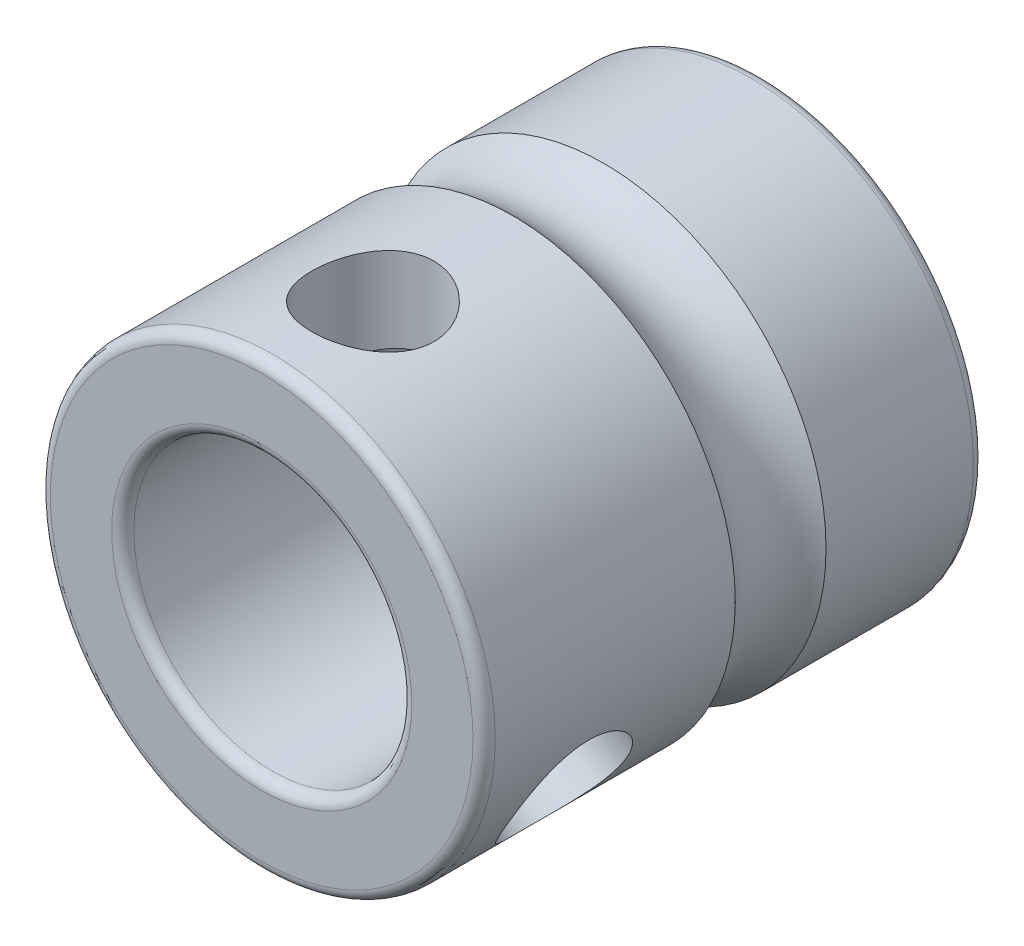
ISO-10303-21;
HEADER;
FILE_DESCRIPTION(('STEP AP214'),'2;1');
FILE_NAME('part.step','',(''),(''),'','','');
FILE_SCHEMA(('AUTOMOTIVE_DESIGN { 1 0 10303 214 1 1 1 1 }'));
ENDSEC;
DATA;
#1=APPLICATION_CONTEXT('core data for automotive mechanical design processes');
#2=APPLICATION_PROTOCOL_DEFINITION('international standard','automotive_design',2000,#1);
#3=PRODUCT_CONTEXT('',#1,'mechanical');
#4=PRODUCT('Part','Part','',(#3));
#5=PRODUCT_RELATED_PRODUCT_CATEGORY('part','',(#4));
#6=PRODUCT_DEFINITION_FORMATION('','',#4);
#7=PRODUCT_DEFINITION_CONTEXT('part definition',#1,'design');
#8=PRODUCT_DEFINITION('design','',#6,#7);
#9=PRODUCT_DEFINITION_SHAPE('','',#8);
#10=(LENGTH_UNIT() NAMED_UNIT(*) SI_UNIT(.MILLI.,.METRE.));
#11=(NAMED_UNIT(*) PLANE_ANGLE_UNIT() SI_UNIT($,.RADIAN.));
#12=(NAMED_UNIT(*) SI_UNIT($,.STERADIAN.) SOLID_ANGLE_UNIT());
#13=UNCERTAINTY_MEASURE_WITH_UNIT(LENGTH_MEASURE(1.E-05),#10,'distance_accuracy_value','');
#14=(GEOMETRIC_REPRESENTATION_CONTEXT(3) GLOBAL_UNCERTAINTY_ASSIGNED_CONTEXT((#13)) GLOBAL_UNIT_ASSIGNED_CONTEXT((#10,
#11,#12)) REPRESENTATION_CONTEXT('',''));
#15=CARTESIAN_POINT('',(0.,0.,0.));
#16=DIRECTION('',(0.,0.,1.));
#17=DIRECTION('',(1.,0.,0.));
#18=AXIS2_PLACEMENT_3D('',#15,#16,#17);
#19=CARTESIAN_POINT('',(0.,0.,-10.4));
#20=DIRECTION('',(0.,0.,1.));
#21=DIRECTION('',(1.,0.,0.));
#22=AXIS2_PLACEMENT_3D('',#19,#20,#21);
#23=TOROIDAL_SURFACE('',#22,8.1,0.600000000000001);
#24=CARTESIAN_POINT('',(0.,0.,-11.));
#25=DIRECTION('',(0.,0.,1.));
#26=DIRECTION('',(1.,0.,0.));
#27=AXIS2_PLACEMENT_3D('',#24,#25,#26);
#28=CIRCLE('',#27,8.1);
#29=CARTESIAN_POINT('',(8.1,0.,-11.));
#30=VERTEX_POINT('',#29);
#31=EDGE_CURVE('E12',#30,#30,#28,.T.);
#32=ORIENTED_EDGE('',*,*,#31,.F.);
#33=EDGE_LOOP('',(#32));
#34=FACE_BOUND('',#33,.T.);
#35=CARTESIAN_POINT('',(0.,0.,-10.4));
#36=DIRECTION('',(0.,0.,1.));
#37=DIRECTION('',(1.,0.,0.));
#38=AXIS2_PLACEMENT_3D('',#35,#36,#37);
#39=CIRCLE('',#38,7.5);
#40=CARTESIAN_POINT('',(7.5,0.,-10.4));
#41=VERTEX_POINT('',#40);
#42=EDGE_CURVE('E77',#41,#41,#39,.T.);
#43=ORIENTED_EDGE('',*,*,#42,.T.);
#44=EDGE_LOOP('',(#43));
#45=FACE_BOUND('',#44,.T.);
#46=ADVANCED_FACE('F43',(#34,#45),#23,.T.);
#47=CARTESIAN_POINT('',(0.,11.4,-11.));
#48=DIRECTION('',(0.,0.,1.));
#49=DIRECTION('',(1.,0.,0.));
#50=AXIS2_PLACEMENT_3D('',#47,#48,#49);
#51=PLANE('',#50);
#52=CARTESIAN_POINT('',(0.,0.,-11.));
#53=DIRECTION('',(0.,0.,1.));
#54=DIRECTION('',(1.,0.,0.));
#55=AXIS2_PLACEMENT_3D('',#52,#53,#54);
#56=CIRCLE('',#55,11.4);
#57=CARTESIAN_POINT('',(11.4,0.,-11.));
#58=VERTEX_POINT('',#57);
#59=EDGE_CURVE('E49',#58,#58,#56,.T.);
#60=ORIENTED_EDGE('',*,*,#59,.F.);
#61=EDGE_LOOP('',(#60));
#62=FACE_BOUND('',#61,.T.);
#63=ORIENTED_EDGE('',*,*,#31,.T.);
#64=EDGE_LOOP('',(#63));
#65=FACE_BOUND('',#64,.T.);
#66=ADVANCED_FACE('F171',(#62,#65),#51,.F.);
#67=CARTESIAN_POINT('',(0.,0.,-10.4));
#68=DIRECTION('',(0.,0.,1.));
#69=DIRECTION('',(1.,0.,0.));
#70=AXIS2_PLACEMENT_3D('',#67,#68,#69);
#71=TOROIDAL_SURFACE('',#70,11.4,0.600000000000002);
#72=CARTESIAN_POINT('',(0.,0.,-10.4));
#73=DIRECTION('',(0.,0.,1.));
#74=DIRECTION('',(1.,0.,0.));
#75=AXIS2_PLACEMENT_3D('',#72,#73,#74);
#76=CIRCLE('',#75,12.);
#77=CARTESIAN_POINT('',(12.,0.,-10.4));
#78=VERTEX_POINT('',#77);
#79=EDGE_CURVE('E53',#78,#78,#76,.T.);
#80=ORIENTED_EDGE('',*,*,#79,.F.);
#81=EDGE_LOOP('',(#80));
#82=FACE_BOUND('',#81,.T.);
#83=ORIENTED_EDGE('',*,*,#59,.T.);
#84=EDGE_LOOP('',(#83));
#85=FACE_BOUND('',#84,.T.);
#86=ADVANCED_FACE('F166',(#82,#85),#71,.T.);
#87=CARTESIAN_POINT('',(0.,0.,2.44948974278318));
#88=DIRECTION('',(0.,0.,1.));
#89=DIRECTION('',(1.,0.,0.));
#90=AXIS2_PLACEMENT_3D('',#87,#88,#89);
#91=CYLINDRICAL_SURFACE('',#90,12.);
#92=CARTESIAN_POINT('',(0.,0.,-2.44948974278318));
#93=DIRECTION('',(0.,0.,1.));
#94=DIRECTION('',(1.,0.,0.));
#95=AXIS2_PLACEMENT_3D('',#92,#93,#94);
#96=CIRCLE('',#95,12.);
#97=CARTESIAN_POINT('',(12.,0.,-2.44948974278318));
#98=VERTEX_POINT('',#97);
#99=EDGE_CURVE('E57',#98,#98,#96,.T.);
#100=ORIENTED_EDGE('',*,*,#99,.F.);
#101=EDGE_LOOP('',(#100));
#102=FACE_BOUND('',#101,.T.);
#103=ORIENTED_EDGE('',*,*,#79,.T.);
#104=EDGE_LOOP('',(#103));
#105=FACE_BOUND('',#104,.T.);
#106=ADVANCED_FACE('F160',(#102,#105),#91,.T.);
#107=CARTESIAN_POINT('',(0.,0.,0.));
#108=DIRECTION('',(0.,0.,1.));
#109=DIRECTION('',(1.,0.,0.));
#110=AXIS2_PLACEMENT_3D('',#107,#108,#109);
#111=TOROIDAL_SURFACE('',#110,14.5,3.5);
#112=CARTESIAN_POINT('',(0.,0.,2.44948974278318));
#113=DIRECTION('',(0.,0.,1.));
#114=DIRECTION('',(1.,0.,0.));
#115=AXIS2_PLACEMENT_3D('',#112,#113,#114);
#116=CIRCLE('',#115,12.);
#117=CARTESIAN_POINT('',(12.,0.,2.44948974278318));
#118=VERTEX_POINT('',#117);
#119=EDGE_CURVE('E62',#118,#118,#116,.T.);
#120=ORIENTED_EDGE('',*,*,#119,.F.);
#121=EDGE_LOOP('',(#120));
#122=FACE_BOUND('',#121,.T.);
#123=ORIENTED_EDGE('',*,*,#99,.T.);
#124=EDGE_LOOP('',(#123));
#125=FACE_BOUND('',#124,.T.);
#126=ADVANCED_FACE('F153',(#122,#125),#111,.F.);
#127=CARTESIAN_POINT('',(0.,0.,2.44948974278318));
#128=DIRECTION('',(0.,0.,1.));
#129=DIRECTION('',(1.,0.,0.));
#130=AXIS2_PLACEMENT_3D('',#127,#128,#129);
#131=CYLINDRICAL_SURFACE('',#130,12.);
#132=CARTESIAN_POINT('',(8.34162149002849,-8.62654918939751,9.99999999999999));
#133=CARTESIAN_POINT('',(8.34162597882696,-8.62654724868121,10.1815608932859));
#134=CARTESIAN_POINT('',(8.35289109863404,-8.6156949666771,10.363162461232));
#135=CARTESIAN_POINT('',(8.39723767746367,-8.5724749753368,10.7211054154445));
#136=CARTESIAN_POINT('',(8.43032918301446,-8.5400973579891,10.8974443402664));
#137=CARTESIAN_POINT('',(8.51622058241159,-8.45444444640412,11.2396315743765));
#138=CARTESIAN_POINT('',(8.56899156172867,-8.40119980571649,11.4054948592071));
#139=CARTESIAN_POINT('',(8.69127533502788,-8.27462661015084,11.7227344363098));
#140=CARTESIAN_POINT('',(8.76078972896686,-8.20129613583126,11.8741093421775));
#141=CARTESIAN_POINT('',(8.91487431452831,-8.03357085974569,12.1621009246344));
#142=CARTESIAN_POINT('',(8.99976633111907,-7.93871196477519,12.298275222456));
#143=CARTESIAN_POINT('',(9.17933935308747,-7.73036958203403,12.548082403518));
#144=CARTESIAN_POINT('',(9.27402142671182,-7.61688406101502,12.6617128229158));
#145=CARTESIAN_POINT('',(9.47063965576773,-7.37103396255142,12.865069607546));
#146=CARTESIAN_POINT('',(9.57267224425636,-7.23837946019439,12.9543534727581));
#147=CARTESIAN_POINT('',(9.7780702582167,-6.95840766324611,13.1035922775495));
#148=CARTESIAN_POINT('',(9.88143544065887,-6.81109301024731,13.1635524894433));
#149=CARTESIAN_POINT('',(10.0828109326975,-6.50915049754147,13.2510024893653));
#150=CARTESIAN_POINT('',(10.1808903242944,-6.35478710611992,13.2792454320334));
#151=CARTESIAN_POINT('',(10.3708410127679,-6.03982216799505,13.3048315973593));
#152=CARTESIAN_POINT('',(10.4627134091717,-5.87922173412133,13.3021803072324));
#153=CARTESIAN_POINT('',(10.6351907164488,-5.5609908529726,13.2665777072183));
#154=CARTESIAN_POINT('',(10.7160316515717,-5.40339619711521,13.2344405440335));
#155=CARTESIAN_POINT('',(10.8676288463948,-5.09163117371103,13.1420972308137));
#156=CARTESIAN_POINT('',(10.9383845131594,-4.93746100794721,13.0818894313307));
#157=CARTESIAN_POINT('',(11.0696934078398,-4.63565288796186,12.9345077089068));
#158=CARTESIAN_POINT('',(11.1301331268504,-4.48809933577847,12.8470603997728));
#159=CARTESIAN_POINT('',(11.2398603247497,-4.2057716659124,12.6478932167063));
#160=CARTESIAN_POINT('',(11.2891455076191,-4.07100018256655,12.5361683548081));
#161=CARTESIAN_POINT('',(11.3784763797029,-3.81436211541914,12.2873187773633));
#162=CARTESIAN_POINT('',(11.4181685831356,-3.69305928683875,12.1494849088322));
#163=CARTESIAN_POINT('',(11.4870411089614,-3.47292766348076,11.8545591561588));
#164=CARTESIAN_POINT('',(11.5162207034994,-3.37410042500642,11.6974659395776));
#165=CARTESIAN_POINT('',(11.5651999561529,-3.20222234902762,11.3669658461832));
#166=CARTESIAN_POINT('',(11.5849333244726,-3.12935457044889,11.193453625562));
#167=CARTESIAN_POINT('',(11.6155706713604,-3.01365888528319,10.8359567702836));
#168=CARTESIAN_POINT('',(11.6264770007366,-2.97082298104399,10.6519749378625));
#169=CARTESIAN_POINT('',(11.6398105807407,-2.9181380971272,10.2850071783899));
#170=CARTESIAN_POINT('',(11.6424954697098,-2.90728721117038,10.1021743041233));
#171=CARTESIAN_POINT('',(11.6402549859672,-2.91624532658518,9.73732293920555));
#172=CARTESIAN_POINT('',(11.6353304821482,-2.93605082740056,9.55530435795301));
#173=CARTESIAN_POINT('',(11.6178065060821,-3.0046243910022,9.20116224264798));
#174=CARTESIAN_POINT('',(11.6053685556624,-3.05278240151022,9.02891171344381));
#175=CARTESIAN_POINT('',(11.5724025582147,-3.17545380353813,8.69489663356935));
#176=CARTESIAN_POINT('',(11.5518734059446,-3.24997079549969,8.53313351897576));
#177=CARTESIAN_POINT('',(11.5013776931984,-3.42442930188007,8.22054381163969));
#178=CARTESIAN_POINT('',(11.4712033862377,-3.52492016424834,8.07005768375723));
#179=CARTESIAN_POINT('',(11.4006803348685,-3.74673267690168,7.7879912748003));
#180=CARTESIAN_POINT('',(11.3603295514736,-3.86805850017954,7.65641479081694));
#181=CARTESIAN_POINT('',(11.2672428762974,-4.13150285281599,7.41171328992493));
#182=CARTESIAN_POINT('',(11.2141620771918,-4.27414902094395,7.2992860299857));
#183=CARTESIAN_POINT('',(11.095878312988,-4.57243776712123,7.10121393911501));
#184=CARTESIAN_POINT('',(11.0306759921842,-4.72807965416777,7.01556768534294));
#185=CARTESIAN_POINT('',(10.888910081526,-5.04595475485961,6.87429117337354));
#186=CARTESIAN_POINT('',(10.8124379564357,-5.20812790212057,6.81843459812851));
#187=CARTESIAN_POINT('',(10.6489031906269,-5.53481565138483,6.73768096606347));
#188=CARTESIAN_POINT('',(10.5618430631809,-5.69932968957615,6.71277657781318));
#189=CARTESIAN_POINT('',(10.3822703374604,-6.02006234524503,6.69511761917684));
#190=CARTESIAN_POINT('',(10.290027611634,-6.17637664214524,6.70134253547289));
#191=CARTESIAN_POINT('',(10.1004524777623,-6.4817559896797,6.74337916361965));
#192=CARTESIAN_POINT('',(10.0031202830267,-6.63082134362713,6.7791896364098));
#193=CARTESIAN_POINT('',(9.80754753946568,-6.91677777030015,6.87878952177689));
#194=CARTESIAN_POINT('',(9.70931984681066,-7.05375411963452,6.94236029618038));
#195=CARTESIAN_POINT('',(9.51488423163109,-7.31391714489876,7.09548166526427));
#196=CARTESIAN_POINT('',(9.41867660795899,-7.43710179197724,7.18503607536972));
#197=CARTESIAN_POINT('',(9.22947372772244,-7.67072755484813,7.39050407196997));
#198=CARTESIAN_POINT('',(9.13664395454328,-7.78071502303152,7.50708577851597));
#199=CARTESIAN_POINT('',(8.96124637929236,-7.98210088927556,7.76204745289013));
#200=CARTESIAN_POINT('',(8.87868134190777,-8.07349428343913,7.90043327074441));
#201=CARTESIAN_POINT('',(8.72601268841057,-8.23830379382413,8.19903561036448));
#202=CARTESIAN_POINT('',(8.65625243373562,-8.31124026633035,8.3596933262888));
#203=CARTESIAN_POINT('',(8.53563339218108,-8.43507460244735,8.69585121189064));
#204=CARTESIAN_POINT('',(8.48476299742788,-8.48598600371342,8.87134218481602));
#205=CARTESIAN_POINT('',(8.41103770281592,-8.55901308894014,9.20499266443268));
#206=CARTESIAN_POINT('',(8.38512115553236,-8.5843067665635,9.36179249604522));
#207=CARTESIAN_POINT('',(8.35041219161291,-8.61807456816613,9.67905128068143));
#208=CARTESIAN_POINT('',(8.34161752216748,-8.62655090488833,9.83950974950909));
#209=CARTESIAN_POINT('',(8.34162149002849,-8.62654918939751,9.99999999999999));
#210=B_SPLINE_CURVE_WITH_KNOTS('',3,(#132,#133,#134,#135,#136,#137,#138,#139,#140,#141,#142,
#143,#144,#145,#146,#147,#148,#149,#150,#151,#152,#153,#154,#155,#156,#157,#158,#159,#160,#161,
#162,#163,#164,#165,#166,#167,#168,#169,#170,#171,#172,#173,#174,#175,#176,#177,#178,#179,#180,
#181,#182,#183,#184,#185,#186,#187,#188,#189,#190,#191,#192,#193,#194,#195,#196,#197,#198,#199,
#200,#201,#202,#203,#204,#205,#206,#207,#208,#209),.UNSPECIFIED.,.T.,.F.,(4,2,2,2,2,2,2,2,2,2,2,
2,2,2,2,2,2,2,2,2,2,2,2,2,2,2,2,2,2,2,2,2,2,2,2,2,2,2,4),(0.,0.54409210220803,1.08843482103126,
1.63198088256237,2.17557890455175,2.73224768973144,3.28897728031707,3.85523724370083,
4.42139535759207,4.97380484642524,5.5261162216869,6.06362198884202,6.60115934415436,
7.14427560321533,7.68750355438032,8.24843637294086,8.8094080210025,9.37426063704975,
9.93896277256269,10.4857775398833,11.0325298727543,11.5679269689412,12.1033972246639,
12.6512808123771,13.1992742628603,13.7642414322072,14.3291785804692,14.8897603608678,
15.450209334819,15.9924079289159,16.5345838165673,17.0725644816093,17.6106241834979,
18.163756458817,18.717037392601,19.2834867998221,19.8495875439408,20.33059954932,
20.8115482613093),.UNSPECIFIED.);
#211=CARTESIAN_POINT('',(8.34162149002849,-8.62654918939751,9.99999999999999));
#212=VERTEX_POINT('',#211);
#213=EDGE_CURVE('E109',#212,#212,#210,.T.);
#214=ORIENTED_EDGE('',*,*,#213,.T.);
#215=EDGE_LOOP('',(#214));
#216=FACE_BOUND('',#215,.T.);
#217=CARTESIAN_POINT('',(0.,12.,6.69999999999999));
#218=CARTESIAN_POINT('',(0.181707456655392,11.9999974861652,6.7000038580071));
#219=CARTESIAN_POINT('',(0.363455467151136,11.9958324558093,6.71505820174495));
#220=CARTESIAN_POINT('',(0.721702025112803,11.9796223524806,6.77476259638667));
#221=CARTESIAN_POINT('',(0.898198243987293,11.9675738369172,6.81942557701682));
#222=CARTESIAN_POINT('',(1.24071935100052,11.9369243071335,6.9367749729298));
#223=CARTESIAN_POINT('',(1.40675787284901,11.918332041587,7.00942398445397));
#224=CARTESIAN_POINT('',(1.72429506455014,11.8765520201402,7.18054094632335));
#225=CARTESIAN_POINT('',(1.87579252266,11.8533638817472,7.27901104585632));
#226=CARTESIAN_POINT('',(2.16366273562177,11.8042524913803,7.50152376005319));
#227=CARTESIAN_POINT('',(2.29962810702433,11.7782801865926,7.62608259159173));
#228=CARTESIAN_POINT('',(2.54902724441398,11.7268371561793,7.89613433140101));
#229=CARTESIAN_POINT('',(2.66245791043924,11.701366499996,8.04163011509996));
#230=CARTESIAN_POINT('',(2.86559136576084,11.6533048984203,8.35272399436011));
#231=CARTESIAN_POINT('',(2.95481868219365,11.6307756282875,8.5186429653905));
#232=CARTESIAN_POINT('',(3.10394747136597,11.5918717818903,8.86384816097355));
#233=CARTESIAN_POINT('',(3.16385473523224,11.5754959903749,9.04313173775919));
#234=CARTESIAN_POINT('',(3.25121500007717,11.5512608187644,9.4054493275189));
#235=CARTESIAN_POINT('',(3.27940969773903,11.5432071826496,9.58829118846654));
#236=CARTESIAN_POINT('',(3.30485781333163,11.5359483767863,9.95627347223456));
#237=CARTESIAN_POINT('',(3.30211741266527,11.536741439304,10.1414134284679));
#238=CARTESIAN_POINT('',(3.26636043726416,11.5469129643086,10.5028908974369));
#239=CARTESIAN_POINT('',(3.23424871640565,11.556034823635,10.6793262973413));
#240=CARTESIAN_POINT('',(3.14211291405798,11.5814242508659,11.0242030857142));
#241=CARTESIAN_POINT('',(3.08208647587927,11.5976924220886,11.1926437979107));
#242=CARTESIAN_POINT('',(2.93510514807216,11.6357620137582,11.5190732929997));
#243=CARTESIAN_POINT('',(2.84783880554101,11.6576268761729,11.6769141258645));
#244=CARTESIAN_POINT('',(2.64907188433123,11.7043930036352,11.9760261793401));
#245=CARTESIAN_POINT('',(2.53756626411726,11.7292948998828,12.1172939434874));
#246=CARTESIAN_POINT('',(2.28889115727237,11.7803908733527,12.3844109759946));
#247=CARTESIAN_POINT('',(2.15096387560414,11.8065997679186,12.5095529801759));
#248=CARTESIAN_POINT('',(1.85575834827167,11.8565821191808,12.7350801834245));
#249=CARTESIAN_POINT('',(1.69847924151675,11.8803554674171,12.8354642802513));
#250=CARTESIAN_POINT('',(1.36789405484499,11.9229500824462,13.0089651633044));
#251=CARTESIAN_POINT('',(1.19451380282824,11.9417467220791,13.0819470673951));
#252=CARTESIAN_POINT('',(0.837308264087409,11.9720923490111,13.1975193985918));
#253=CARTESIAN_POINT('',(0.653485420470113,11.9836430239934,13.240116902953));
#254=CARTESIAN_POINT('',(0.286643012538279,11.9979372133937,13.2925847829862));
#255=CARTESIAN_POINT('',(0.103770732395647,12.0009392097625,13.3034159726664));
#256=CARTESIAN_POINT('',(-0.26117976919502,11.9985445846312,13.2947066691749));
#257=CARTESIAN_POINT('',(-0.443258076118004,11.9931488907448,13.2751695305066));
#258=CARTESIAN_POINT('',(-0.79797554041599,11.9747327184257,13.207063877035));
#259=CARTESIAN_POINT('',(-0.970726847758045,11.9618546895005,13.1590373964297));
#260=CARTESIAN_POINT('',(-1.30569933522384,11.9299406353346,13.0359512101584));
#261=CARTESIAN_POINT('',(-1.46791933662356,11.9109039222006,12.9608884845769));
#262=CARTESIAN_POINT('',(-1.7809105918353,11.8681859542535,12.784119566701));
#263=CARTESIAN_POINT('',(-1.93137900728731,11.8444174937566,12.6818987726159));
#264=CARTESIAN_POINT('',(-2.21336193422562,11.7949801835641,12.4543569193566));
#265=CARTESIAN_POINT('',(-2.34487244617448,11.7693109345843,12.3290309983798));
#266=CARTESIAN_POINT('',(-2.58930031441942,11.7180038248747,12.0543430949957));
#267=CARTESIAN_POINT('',(-2.70153807600961,11.6923902125808,11.9043706818683));
#268=CARTESIAN_POINT('',(-2.89927640980156,11.6449377644269,11.5871729733186));
#269=CARTESIAN_POINT('',(-2.98477803160912,11.6230987803979,11.4199483555252));
#270=CARTESIAN_POINT('',(-3.12597833620711,11.5859222326554,11.0737753396533));
#271=CARTESIAN_POINT('',(-3.18184454534681,11.5705482276667,10.8948994024413));
#272=CARTESIAN_POINT('',(-3.26255238400292,11.5480535509474,10.5297929251884));
#273=CARTESIAN_POINT('',(-3.28740256333029,11.5409306047869,10.3435644265476));
#274=CARTESIAN_POINT('',(-3.30485863501114,11.5359429499097,9.97602023433294));
#275=CARTESIAN_POINT('',(-3.29856028737984,11.5377636028944,9.79476009823207));
#276=CARTESIAN_POINT('',(-3.25645759685206,11.5497165657594,9.43599316795832));
#277=CARTESIAN_POINT('',(-3.22065410689512,11.5598486353717,9.25848626543848));
#278=CARTESIAN_POINT('',(-3.12121099114994,11.5870895605603,8.91374204531989));
#279=CARTESIAN_POINT('',(-3.05781745241309,11.6041366489056,8.74642851468997));
#280=CARTESIAN_POINT('',(-2.9051841992214,11.6432849569633,8.42468278001942));
#281=CARTESIAN_POINT('',(-2.81594020027398,11.6653870143658,8.27025271677268));
#282=CARTESIAN_POINT('',(-2.61087735741719,11.7130145498445,7.97346165389194));
#283=CARTESIAN_POINT('',(-2.49431746011362,11.7386252060063,7.8316262899403));
#284=CARTESIAN_POINT('',(-2.23932267707913,11.7899244950895,7.56917257775288));
#285=CARTESIAN_POINT('',(-2.10088240329256,11.8156131456848,7.44855947101134));
#286=CARTESIAN_POINT('',(-1.80218450049857,11.8648868352346,7.22921481484121));
#287=CARTESIAN_POINT('',(-1.64149541824648,11.8884092855424,7.13105548778074));
#288=CARTESIAN_POINT('',(-1.30525174527719,11.9300012675817,6.96329626657418));
#289=CARTESIAN_POINT('',(-1.12970616985008,11.9480740763345,6.89367920007655));
#290=CARTESIAN_POINT('',(-0.795839317486006,11.9745719493524,6.79339273497003));
#291=CARTESIAN_POINT('',(-0.638869833097783,11.9840358209605,6.75845490409718));
#292=CARTESIAN_POINT('',(-0.321277189746121,11.9967506068661,6.71175813950255));
#293=CARTESIAN_POINT('',(-0.160654445337288,12.0000022225766,6.69999658898977));
#294=CARTESIAN_POINT('',(0.,12.,6.69999999999999));
#295=B_SPLINE_CURVE_WITH_KNOTS('',3,(#217,#218,#219,#220,#221,#222,#223,#224,#225,#226,#227,
#228,#229,#230,#231,#232,#233,#234,#235,#236,#237,#238,#239,#240,#241,#242,#243,#244,#245,#246,
#247,#248,#249,#250,#251,#252,#253,#254,#255,#256,#257,#258,#259,#260,#261,#262,#263,#264,#265,
#266,#267,#268,#269,#270,#271,#272,#273,#274,#275,#276,#277,#278,#279,#280,#281,#282,#283,#284,
#285,#286,#287,#288,#289,#290,#291,#292,#293,#294),.UNSPECIFIED.,.T.,.F.,(4,2,2,2,2,2,2,2,2,2,2,
2,2,2,2,2,2,2,2,2,2,2,2,2,2,2,2,2,2,2,2,2,2,2,2,2,2,2,4),(0.,0.544532982470123,1.08930391254841,
1.63334925998315,2.17743990477138,2.73353336948589,3.28970327969284,3.85611622049323,
4.42241724150016,4.9751787031269,5.52782971477974,6.06400827118896,6.60023210249235,
7.14282658189464,7.68553402386457,8.24711950854656,8.8087299909238,9.37306974064928,
9.93727799915695,10.4842355246019,11.031132637091,11.5679440047452,12.1048153521794,
12.6526915560579,13.2006831764189,13.7651856904991,14.3296660405897,14.8909204806412,
15.4520201723264,15.9935245710966,16.5350133165173,17.0717682273509,17.6086121516721,
18.1621747392067,18.7158738548551,19.2824117658896,19.8486083193942,20.3301049236031,
20.8115471598042),.UNSPECIFIED.);
#296=CARTESIAN_POINT('',(0.,12.,6.69999999999999));
#297=VERTEX_POINT('',#296);
#298=EDGE_CURVE('E88',#297,#297,#295,.T.);
#299=ORIENTED_EDGE('',*,*,#298,.T.);
#300=EDGE_LOOP('',(#299));
#301=FACE_BOUND('',#300,.T.);
#302=CARTESIAN_POINT('',(0.,0.,15.4));
#303=DIRECTION('',(0.,0.,1.));
#304=DIRECTION('',(1.,0.,0.));
#305=AXIS2_PLACEMENT_3D('',#302,#303,#304);
#306=CIRCLE('',#305,12.);
#307=CARTESIAN_POINT('',(12.,0.,15.4));
#308=VERTEX_POINT('',#307);
#309=EDGE_CURVE('E65',#308,#308,#306,.T.);
#310=ORIENTED_EDGE('',*,*,#309,.F.);
#311=EDGE_LOOP('',(#310));
#312=FACE_BOUND('',#311,.T.);
#313=ORIENTED_EDGE('',*,*,#119,.T.);
#314=EDGE_LOOP('',(#313));
#315=FACE_BOUND('',#314,.T.);
#316=ADVANCED_FACE('F124',(#216,#301,#312,#315),#131,.T.);
#317=CARTESIAN_POINT('',(0.,0.,15.4));
#318=DIRECTION('',(0.,0.,1.));
#319=DIRECTION('',(1.,0.,0.));
#320=AXIS2_PLACEMENT_3D('',#317,#318,#319);
#321=TOROIDAL_SURFACE('',#320,11.4,0.599999999999999);
#322=CARTESIAN_POINT('',(0.,0.,16.));
#323=DIRECTION('',(0.,0.,1.));
#324=DIRECTION('',(1.,0.,0.));
#325=AXIS2_PLACEMENT_3D('',#322,#323,#324);
#326=CIRCLE('',#325,11.4);
#327=CARTESIAN_POINT('',(11.4,0.,16.));
#328=VERTEX_POINT('',#327);
#329=EDGE_CURVE('E68',#328,#328,#326,.T.);
#330=ORIENTED_EDGE('',*,*,#329,.F.);
#331=EDGE_LOOP('',(#330));
#332=FACE_BOUND('',#331,.T.);
#333=ORIENTED_EDGE('',*,*,#309,.T.);
#334=EDGE_LOOP('',(#333));
#335=FACE_BOUND('',#334,.T.);
#336=ADVANCED_FACE('F143',(#332,#335),#321,.T.);
#337=CARTESIAN_POINT('',(0.,11.4,16.));
#338=DIRECTION('',(0.,0.,-1.));
#339=DIRECTION('',(-1.,0.,0.));
#340=AXIS2_PLACEMENT_3D('',#337,#338,#339);
#341=PLANE('',#340);
#342=CARTESIAN_POINT('',(0.,0.,16.));
#343=DIRECTION('',(0.,0.,1.));
#344=DIRECTION('',(1.,0.,0.));
#345=AXIS2_PLACEMENT_3D('',#342,#343,#344);
#346=CIRCLE('',#345,8.1);
#347=CARTESIAN_POINT('',(8.1,0.,16.));
#348=VERTEX_POINT('',#347);
#349=EDGE_CURVE('E71',#348,#348,#346,.T.);
#350=ORIENTED_EDGE('',*,*,#349,.F.);
#351=EDGE_LOOP('',(#350));
#352=FACE_BOUND('',#351,.T.);
#353=ORIENTED_EDGE('',*,*,#329,.T.);
#354=EDGE_LOOP('',(#353));
#355=FACE_BOUND('',#354,.T.);
#356=ADVANCED_FACE('F138',(#352,#355),#341,.F.);
#357=CARTESIAN_POINT('',(0.,0.,15.4));
#358=DIRECTION('',(0.,0.,1.));
#359=DIRECTION('',(1.,0.,0.));
#360=AXIS2_PLACEMENT_3D('',#357,#358,#359);
#361=TOROIDAL_SURFACE('',#360,8.1,0.6);
#362=CARTESIAN_POINT('',(0.,0.,15.4));
#363=DIRECTION('',(0.,0.,1.));
#364=DIRECTION('',(1.,0.,0.));
#365=AXIS2_PLACEMENT_3D('',#362,#363,#364);
#366=CIRCLE('',#365,7.5);
#367=CARTESIAN_POINT('',(7.5,0.,15.4));
#368=VERTEX_POINT('',#367);
#369=EDGE_CURVE('E74',#368,#368,#366,.T.);
#370=ORIENTED_EDGE('',*,*,#369,.F.);
#371=EDGE_LOOP('',(#370));
#372=FACE_BOUND('',#371,.T.);
#373=ORIENTED_EDGE('',*,*,#349,.T.);
#374=EDGE_LOOP('',(#373));
#375=FACE_BOUND('',#374,.T.);
#376=ADVANCED_FACE('F131',(#372,#375),#361,.T.);
#377=CARTESIAN_POINT('',(0.,0.,2.44948974278318));
#378=DIRECTION('',(0.,0.,1.));
#379=DIRECTION('',(1.,0.,0.));
#380=AXIS2_PLACEMENT_3D('',#377,#378,#379);
#381=CYLINDRICAL_SURFACE('',#380,7.5);
#382=CARTESIAN_POINT('',(4.18266662856705,-6.22537548058521,9.99999999999999));
#383=CARTESIAN_POINT('',(4.18266814707095,-6.22537506366574,9.91248038913765));
#384=CARTESIAN_POINT('',(4.1858953474956,-6.22321076178839,9.824931805725));
#385=CARTESIAN_POINT('',(4.19871988845612,-6.214563449613,9.65050235809528));
#386=CARTESIAN_POINT('',(4.20832108023146,-6.20807782831503,9.5636219297093));
#387=CARTESIAN_POINT('',(4.24646616546878,-6.18211544134455,9.30464812713879));
#388=CARTESIAN_POINT('',(4.28435083349165,-6.15613314448401,9.1344516881291));
#389=CARTESIAN_POINT('',(4.38164204103474,-6.08725560913655,8.80497056873119));
#390=CARTESIAN_POINT('',(4.44095391772341,-6.04443468914702,8.64564150215422));
#391=CARTESIAN_POINT('',(4.57699520380821,-5.94208247384222,8.34044383528008));
#392=CARTESIAN_POINT('',(4.65372188055158,-5.88255379988686,8.19457312820268));
#393=CARTESIAN_POINT('',(4.82554979797333,-5.74256775256437,7.91025350457892));
#394=CARTESIAN_POINT('',(4.921505379614,-5.66102617807867,7.77285489783428));
#395=CARTESIAN_POINT('',(5.12314639696188,-5.47921487323846,7.5191072328707));
#396=CARTESIAN_POINT('',(5.22883581745922,-5.37893745546267,7.40276685367492));
#397=CARTESIAN_POINT('',(5.45027362538981,-5.15465999082883,7.18886557070689));
#398=CARTESIAN_POINT('',(5.56626102323956,-5.02973340528205,7.09251487014119));
#399=CARTESIAN_POINT('',(5.79758680701786,-4.76122990624136,6.92959937248315));
#400=CARTESIAN_POINT('',(5.91292548487436,-4.61766222319028,6.86301990571076));
#401=CARTESIAN_POINT('',(6.13088514308667,-4.32363196742831,6.76543234040437));
#402=CARTESIAN_POINT('',(6.23385618621625,-4.17403447260541,6.7326062468792));
#403=CARTESIAN_POINT('',(6.42993776663899,-3.8651397866712,6.69755300458074));
#404=CARTESIAN_POINT('',(6.52305277717727,-3.7058470479816,6.69531191494217));
#405=CARTESIAN_POINT('',(6.69039598792751,-3.39379502068769,6.72060475468395));
#406=CARTESIAN_POINT('',(6.76547619850312,-3.24132385308594,6.74613249944856));
#407=CARTESIAN_POINT('',(6.90297960708785,-2.93713193252907,6.8227599774656));
#408=CARTESIAN_POINT('',(6.9654018677034,-2.78541123596175,6.87386160363905));
#409=CARTESIAN_POINT('',(7.07822464528913,-2.48493610243605,7.0007475523661));
#410=CARTESIAN_POINT('',(7.1284269714771,-2.33626237210976,7.07689696972028));
#411=CARTESIAN_POINT('',(7.21638180885135,-2.04853649233785,7.25133178754363));
#412=CARTESIAN_POINT('',(7.25412978415525,-1.90948786289678,7.34962523099687));
#413=CARTESIAN_POINT('',(7.32116337269742,-1.63465387037699,7.57436597599515));
#414=CARTESIAN_POINT('',(7.34956934593723,-1.49995151723834,7.70240218847137));
#415=CARTESIAN_POINT('',(7.39605512912587,-1.25078636415603,7.97858424476693));
#416=CARTESIAN_POINT('',(7.41413000319414,-1.13633325667748,8.12673965915693));
#417=CARTESIAN_POINT('',(7.44310628251101,-0.928260933105525,8.44639907981529));
#418=CARTESIAN_POINT('',(7.45369044488772,-0.835663015508658,8.61860182298591));
#419=CARTESIAN_POINT('',(7.46925558716177,-0.682784088478229,8.97701908879017));
#420=CARTESIAN_POINT('',(7.47424110794675,-0.622476909813304,9.1632221252249));
#421=CARTESIAN_POINT('',(7.4805383959406,-0.541385679962727,9.53051092931907));
#422=CARTESIAN_POINT('',(7.48208239702644,-0.518135735576631,9.71104602369673));
#423=CARTESIAN_POINT('',(7.48298370461047,-0.504995026078636,10.0732996557551));
#424=CARTESIAN_POINT('',(7.48234192555059,-0.515090310619592,10.2550176668015));
#425=CARTESIAN_POINT('',(7.47866063562601,-0.565842290458489,10.6000766467598));
#426=CARTESIAN_POINT('',(7.47580452682187,-0.604150580537057,10.7637738646911));
#427=CARTESIAN_POINT('',(7.4668390223445,-0.706346951523085,11.0828623219982));
#428=CARTESIAN_POINT('',(7.46072880525726,-0.770241489994937,11.2382514533135));
#429=CARTESIAN_POINT('',(7.44329900980379,-0.923855230125597,11.5440549276832));
#430=CARTESIAN_POINT('',(7.43176008014613,-1.01459552416725,11.6939416554822));
#431=CARTESIAN_POINT('',(7.40133972780717,-1.21680539853574,11.9782030866265));
#432=CARTESIAN_POINT('',(7.38245488742468,-1.32828461507768,12.1125705317972));
#433=CARTESIAN_POINT('',(7.33303779096456,-1.5793602232788,12.3749695502067));
#434=CARTESIAN_POINT('',(7.30158779190752,-1.72060538758017,12.5012579385326));
#435=CARTESIAN_POINT('',(7.2249221718182,-2.0184464000981,12.7292524324087));
#436=CARTESIAN_POINT('',(7.1797047744198,-2.17504422745389,12.8309553627313));
#437=CARTESIAN_POINT('',(7.07330401523591,-2.49954040231503,13.0072562611274));
#438=CARTESIAN_POINT('',(7.0120039177788,-2.66751442235605,13.0816460929552));
#439=CARTESIAN_POINT('',(6.87300942080918,-3.0075542749296,13.1991355313419));
#440=CARTESIAN_POINT('',(6.79532607218787,-3.1796172802751,13.2422561431475));
#441=CARTESIAN_POINT('',(6.63124693297867,-3.50823322880796,13.2931217894344));
#442=CARTESIAN_POINT('',(6.54596917535403,-3.66496735620487,13.3033163807119));
#443=CARTESIAN_POINT('',(6.36477268634828,-3.97131083355154,13.2947959668572));
#444=CARTESIAN_POINT('',(6.26885622864982,-4.1209216961403,13.2760871279029));
#445=CARTESIAN_POINT('',(6.07416197796898,-4.4025725005813,13.2120424987498));
#446=CARTESIAN_POINT('',(5.97568306915395,-4.53509072172752,13.1678824367273));
#447=CARTESIAN_POINT('',(5.77580216013412,-4.78706540846109,13.0555471201065));
#448=CARTESIAN_POINT('',(5.67439964283192,-4.9065195452778,12.987367592973));
#449=CARTESIAN_POINT('',(5.46787725211974,-5.13587631678531,12.8254834565454));
#450=CARTESIAN_POINT('',(5.36279993618535,-5.24509052956739,12.7307524464972));
#451=CARTESIAN_POINT('',(5.15802149430579,-5.44660327725252,12.5198719817034));
#452=CARTESIAN_POINT('',(5.05832262759914,-5.53889474214209,12.4037136154715));
#453=CARTESIAN_POINT('',(4.86144142257083,-5.71269966756516,12.1428018099246));
#454=CARTESIAN_POINT('',(4.76504497018865,-5.79283462919972,11.9965346551417));
#455=CARTESIAN_POINT('',(4.58926217332529,-5.93307420241105,11.6850290497204));
#456=CARTESIAN_POINT('',(4.50988623304076,-5.99316657486745,11.5197790896178));
#457=CARTESIAN_POINT('',(4.40792690181884,-6.06810992800947,11.2606969380646));
#458=CARTESIAN_POINT('',(4.37675251421533,-6.09058394200186,11.1723070382373));
#459=CARTESIAN_POINT('',(4.32080961189513,-6.13039854968274,10.992414442337));
#460=CARTESIAN_POINT('',(4.29603789924217,-6.1477417067025,10.9009133261625));
#461=CARTESIAN_POINT('',(4.25354094322061,-6.17722083348223,10.715734765697));
#462=CARTESIAN_POINT('',(4.23579719118611,-6.18937048750983,10.6220637348913));
#463=CARTESIAN_POINT('',(4.20772477366514,-6.2084896839136,10.4331426704651));
#464=CARTESIAN_POINT('',(4.19739050589892,-6.21546314013208,10.3378938856479));
#465=CARTESIAN_POINT('',(4.18815503044023,-6.2216850677958,10.2020034278732));
#466=CARTESIAN_POINT('',(4.18609826265211,-6.22306870621235,10.1616451478497));
#467=CARTESIAN_POINT('',(4.1833536945385,-6.22491401996557,10.0808599742043));
#468=CARTESIAN_POINT('',(4.18266592703527,-6.22537567319734,10.0404330789606));
#469=CARTESIAN_POINT('',(4.18266662856705,-6.22537548058521,9.99999999999999));
#470=B_SPLINE_CURVE_WITH_KNOTS('',3,(#382,#383,#384,#385,#386,#387,#388,#389,#390,#391,#392,
#393,#394,#395,#396,#397,#398,#399,#400,#401,#402,#403,#404,#405,#406,#407,#408,#409,#410,#411,
#412,#413,#414,#415,#416,#417,#418,#419,#420,#421,#422,#423,#424,#425,#426,#427,#428,#429,#430,
#431,#432,#433,#434,#435,#436,#437,#438,#439,#440,#441,#442,#443,#444,#445,#446,#447,#448,#449,
#450,#451,#452,#453,#454,#455,#456,#457,#458,#459,#460,#461,#462,#463,#464,#465,#466,#467,#468,
#469),.UNSPECIFIED.,.T.,.F.,(4,2,2,2,2,2,2,2,2,2,2,2,2,2,2,2,2,2,2,2,2,2,2,2,2,2,2,2,2,2,2,2,2,
2,2,2,2,2,2,2,2,2,2,4),(0.,0.262513796703565,0.525186351821455,1.05121039884112,
1.57493839813906,2.09858427312088,2.6552964127743,3.21223747816019,3.79666539083137,
4.38080501032451,4.93150780899022,5.48195958496194,5.99513293699894,6.50834427858923,
7.02939469995605,7.55063467927357,8.112164478848,8.67396233627076,9.25832230467427,
9.84220797341973,10.38531968905,10.9282042166414,11.4303806398299,11.932683884365,
12.4573002737867,12.9821610346413,13.5556963925018,14.1293057832919,14.7071997769744,
15.2847052071026,15.8181181895063,16.3514173907711,16.8618569458808,17.3723873428557,
17.9063097798142,18.4404547740418,19.0157587742044,19.5914134465256,19.8802334491661,
20.1689089152429,20.4568189955201,20.7445111579787,20.8657866811984,20.987065112007),.UNSPECIFIED.);
#471=CARTESIAN_POINT('',(4.18266662856705,-6.22537548058521,9.99999999999999));
#472=VERTEX_POINT('',#471);
#473=EDGE_CURVE('E114',#472,#472,#470,.T.);
#474=ORIENTED_EDGE('',*,*,#473,.T.);
#475=EDGE_LOOP('',(#474));
#476=FACE_BOUND('',#475,.T.);
#477=CARTESIAN_POINT('',(0.,7.5,6.69999999999999));
#478=CARTESIAN_POINT('',(-0.0879847311482285,7.49999916339747,6.70000110569961));
#479=CARTESIAN_POINT('',(-0.175996997215014,7.49844602803682,6.70352584958176));
#480=CARTESIAN_POINT('',(-0.351366884603558,7.49228068446405,6.71757702717314));
#481=CARTESIAN_POINT('',(-0.438724095478251,7.48766669788393,6.72810753127));
#482=CARTESIAN_POINT('',(-0.699148353564272,7.46936181068621,6.77012937265818));
#483=CARTESIAN_POINT('',(-0.870354033452954,7.45120837149461,6.81205073817598));
#484=CARTESIAN_POINT('',(-1.20198690681274,7.4049486896349,6.92173805519077));
#485=CARTESIAN_POINT('',(-1.36244991637905,7.37687770274118,6.98941252215946));
#486=CARTESIAN_POINT('',(-1.66961061716127,7.31347998261239,7.14828341510686));
#487=CARTESIAN_POINT('',(-1.81631160057082,7.27815499118372,7.23947419577205));
#488=CARTESIAN_POINT('',(-2.10000653018776,7.20157240783643,7.44803795134852));
#489=CARTESIAN_POINT('',(-2.23614820310939,7.16010648173826,7.56649217728203));
#490=CARTESIAN_POINT('',(-2.48738427730706,7.07675556511628,7.82392639595056));
#491=CARTESIAN_POINT('',(-2.60246637989259,7.03487034468891,7.96291829750434));
#492=CARTESIAN_POINT('',(-2.8147442164426,6.95276242051047,8.26694501870901));
#493=CARTESIAN_POINT('',(-2.91056780646442,6.91276615547082,8.43300561696841));
#494=CARTESIAN_POINT('',(-3.07254338412069,6.84231946460002,8.78088947837105));
#495=CARTESIAN_POINT('',(-3.13871236626992,6.81186357437461,8.96270364195308));
#496=CARTESIAN_POINT('',(-3.23588245059955,6.76622706292534,9.32713745170523));
#497=CARTESIAN_POINT('',(-3.2685313370064,6.75033534707639,9.50922499716408));
#498=CARTESIAN_POINT('',(-3.30286109054209,6.7336107189292,9.87693330753521));
#499=CARTESIAN_POINT('',(-3.30456201405989,6.73276805382708,10.0625517061181));
#500=CARTESIAN_POINT('',(-3.27817839480312,6.74564212771286,10.4147117471508));
#501=CARTESIAN_POINT('',(-3.2526828375087,6.75809343305132,10.5815033797364));
#502=CARTESIAN_POINT('',(-3.17701041351469,6.79399292623159,10.9081424513598));
#503=CARTESIAN_POINT('',(-3.12682814316212,6.81744352164603,11.0679883617138));
#504=CARTESIAN_POINT('',(-3.00221299270323,6.87324147193864,11.380453852121));
#505=CARTESIAN_POINT('',(-2.92726455943098,6.90577546283839,11.5328329779962));
#506=CARTESIAN_POINT('',(-2.75561421339005,6.97604318032804,11.8234877567638));
#507=CARTESIAN_POINT('',(-2.65890322462696,7.01377907380138,11.9617574903157));
#508=CARTESIAN_POINT('',(-2.43567553794643,7.09456522198151,12.2341359667016));
#509=CARTESIAN_POINT('',(-2.30719698950873,7.13777926332258,12.3665931820037));
#510=CARTESIAN_POINT('',(-2.02947617906421,7.22165198680059,12.6086722212647));
#511=CARTESIAN_POINT('',(-1.88022790424466,7.26230992398205,12.7182874094494));
#512=CARTESIAN_POINT('',(-1.55969088347039,7.33792903553267,12.9143838007991));
#513=CARTESIAN_POINT('',(-1.38789623131368,7.37269543123741,13.000118863187));
#514=CARTESIAN_POINT('',(-1.03039978395,7.43108261686766,13.1408781610372));
#515=CARTESIAN_POINT('',(-0.844706660349272,7.45471029044728,13.1959213677114));
#516=CARTESIAN_POINT('',(-0.478420455019388,7.48682591193497,13.2701060816675));
#517=CARTESIAN_POINT('',(-0.298357081239922,7.49624457576388,13.2914593290439));
#518=CARTESIAN_POINT('',(0.0630150466880967,7.50190911570084,13.3043434382285));
#519=CARTESIAN_POINT('',(0.244323369198442,7.49815934797256,13.2958841621213));
#520=CARTESIAN_POINT('',(0.592186694249517,7.47850074919303,13.2508976366842));
#521=CARTESIAN_POINT('',(0.758995380805726,7.46329326837548,13.2159887516388));
#522=CARTESIAN_POINT('',(1.08416587580587,7.4230345725983,13.1214205443792));
#523=CARTESIAN_POINT('',(1.24252664785619,7.39798215299735,13.0617581932442));
#524=CARTESIAN_POINT('',(1.5519184027483,7.33942268997901,12.9174645915671));
#525=CARTESIAN_POINT('',(1.70256592746072,7.30567600359906,12.8321116314868));
#526=CARTESIAN_POINT('',(1.98794379554315,7.23324204469828,12.639646587627));
#527=CARTESIAN_POINT('',(2.12266719763801,7.19455263283728,12.5325250699202));
#528=CARTESIAN_POINT('',(2.38360776326887,7.11256429520165,12.2896807714699));
#529=CARTESIAN_POINT('',(2.50830803126982,7.06914288563998,12.1523654348902));
#530=CARTESIAN_POINT('',(2.73339109281729,6.98520129494743,11.8581944136938));
#531=CARTESIAN_POINT('',(2.8337658096186,6.94468208056146,11.701332265108));
#532=CARTESIAN_POINT('',(3.00919384524057,6.87052071485939,11.3678431826299));
#533=CARTESIAN_POINT('',(3.08364552897963,6.8370483006437,11.1908590859314));
#534=CARTESIAN_POINT('',(3.20099123884909,6.78291280603644,10.8249139275035));
#535=CARTESIAN_POINT('',(3.24391535338324,6.7622375156548,10.6359644725369));
#536=CARTESIAN_POINT('',(3.29384250276255,6.73804873705575,10.2684586800875));
#537=CARTESIAN_POINT('',(3.3035479699995,6.73324529508494,10.0903536142199));
#538=CARTESIAN_POINT('',(3.29414391629086,6.73785197912193,9.73511334833834));
#539=CARTESIAN_POINT('',(3.27504021830125,6.74725923284115,9.55797795959401));
#540=CARTESIAN_POINT('',(3.21091173097885,6.77799263713358,9.22033175169564));
#541=CARTESIAN_POINT('',(3.16744941548906,6.79859825667164,9.05945186992157));
#542=CARTESIAN_POINT('',(3.05746532140084,6.8487617998554,8.74727739249023));
#543=CARTESIAN_POINT('',(2.9909369088706,6.87832229866269,8.59598556923163));
#544=CARTESIAN_POINT('',(2.83187034160224,6.9453870825091,8.29676070998808));
#545=CARTESIAN_POINT('',(2.73794827914722,6.98327673344704,8.14965170844972));
#546=CARTESIAN_POINT('',(2.5285725176858,7.06178498528322,7.87243945533491));
#547=CARTESIAN_POINT('',(2.41311005746292,7.10240469227264,7.74234316016189));
#548=CARTESIAN_POINT('',(2.15234964445693,7.18593675283174,7.49144276544726));
#549=CARTESIAN_POINT('',(2.0053496547452,7.22875039712266,7.37236917578016));
#550=CARTESIAN_POINT('',(1.69183090195846,7.30847271667419,7.1603777783953));
#551=CARTESIAN_POINT('',(1.525303305105,7.34537870147106,7.0674718734063));
#552=CARTESIAN_POINT('',(1.26540965365048,7.39299938989599,6.95079422078623));
#553=CARTESIAN_POINT('',(1.17761589168647,7.40752288528662,6.91581610652228));
#554=CARTESIAN_POINT('',(0.998983797184402,7.43371742061028,6.85342039207019));
#555=CARTESIAN_POINT('',(0.90814695062772,7.44538983033077,6.82599916040653));
#556=CARTESIAN_POINT('',(0.724344038832954,7.46551132233484,6.77908307669372));
#557=CARTESIAN_POINT('',(0.631383667861016,7.4739681485208,6.75956917433508));
#558=CARTESIAN_POINT('',(0.443927001549319,7.48743910416901,6.72861794615465));
#559=CARTESIAN_POINT('',(0.34943183074203,7.49245564727093,6.71717495776642));
#560=CARTESIAN_POINT('',(0.212254940672742,7.49711592089205,6.70655901809575));
#561=CARTESIAN_POINT('',(0.169850790656585,7.4981966012372,6.70410035049653));
#562=CARTESIAN_POINT('',(0.0849665677745622,7.49963884638194,6.70082056628936));
#563=CARTESIAN_POINT('',(0.0424864941529173,7.50000040398269,6.6999994660744));
#564=CARTESIAN_POINT('',(0.,7.5,6.69999999999999));
#565=B_SPLINE_CURVE_WITH_KNOTS('',3,(#477,#478,#479,#480,#481,#482,#483,#484,#485,#486,#487,
#488,#489,#490,#491,#492,#493,#494,#495,#496,#497,#498,#499,#500,#501,#502,#503,#504,#505,#506,
#507,#508,#509,#510,#511,#512,#513,#514,#515,#516,#517,#518,#519,#520,#521,#522,#523,#524,#525,
#526,#527,#528,#529,#530,#531,#532,#533,#534,#535,#536,#537,#538,#539,#540,#541,#542,#543,#544,
#545,#546,#547,#548,#549,#550,#551,#552,#553,#554,#555,#556,#557,#558,#559,#560,#561,#562,#563,
#564),.UNSPECIFIED.,.T.,.F.,(4,2,2,2,2,2,2,2,2,2,2,2,2,2,2,2,2,2,2,2,2,2,2,2,2,2,2,2,2,2,2,2,2,
2,2,2,2,2,2,2,2,2,2,4),(0.,0.263908137981027,0.527969742197856,1.05672634000278,
1.58362187310803,2.11039103751163,2.66350231121905,3.21693557560544,3.80153371383058,
4.3857963997777,4.93971923790269,5.49328308348472,5.99848931479325,6.50380617948813,
7.02038517612788,7.53718001074771,8.10321196073927,8.66940811856769,9.25169821524364,
9.83362798735841,10.3754748266997,10.9171424380806,11.4281028223961,11.9391257480608,
12.4661108130512,12.9933247485977,13.5622609871058,14.1313858699206,14.7129545868549,
15.2939675586985,15.8264194673694,16.358763770406,16.8603307688871,17.3620421405227,
17.8956278505428,18.4294310631656,19.0086199121015,19.5880717890945,19.8745948333733,
20.1609799473593,20.4466709415004,20.7321612944484,20.8595972617206,20.9870345046935),.UNSPECIFIED.);
#566=CARTESIAN_POINT('',(0.,7.5,6.69999999999999));
#567=VERTEX_POINT('',#566);
#568=EDGE_CURVE('E80',#567,#567,#565,.T.);
#569=ORIENTED_EDGE('',*,*,#568,.T.);
#570=EDGE_LOOP('',(#569));
#571=FACE_BOUND('',#570,.T.);
#572=ORIENTED_EDGE('',*,*,#42,.F.);
#573=EDGE_LOOP('',(#572));
#574=FACE_BOUND('',#573,.T.);
#575=ORIENTED_EDGE('',*,*,#369,.T.);
#576=EDGE_LOOP('',(#575));
#577=FACE_BOUND('',#576,.T.);
#578=ADVANCED_FACE('F94',(#476,#571,#574,#577),#381,.F.);
#579=CARTESIAN_POINT('',(0.,0.,9.99999999999999));
#580=DIRECTION('',(0.,-1.,0.));
#581=DIRECTION('',(0.,0.,-1.));
#582=AXIS2_PLACEMENT_3D('',#579,#580,#581);
#583=CYLINDRICAL_SURFACE('',#582,3.3);
#584=ORIENTED_EDGE('',*,*,#298,.F.);
#585=EDGE_LOOP('',(#584));
#586=FACE_BOUND('',#585,.T.);
#587=ORIENTED_EDGE('',*,*,#568,.F.);
#588=EDGE_LOOP('',(#587));
#589=FACE_BOUND('',#588,.T.);
#590=ADVANCED_FACE('F97',(#586,#589),#583,.F.);
#591=CARTESIAN_POINT('',(0.,0.,9.99999999999999));
#592=DIRECTION('',(-0.866025403784436,0.500000000000004,0.));
#593=DIRECTION('',(-0.500000000000004,-0.866025403784436,0.));
#594=AXIS2_PLACEMENT_3D('',#591,#592,#593);
#595=CYLINDRICAL_SURFACE('',#594,3.3);
#596=ORIENTED_EDGE('',*,*,#213,.F.);
#597=EDGE_LOOP('',(#596));
#598=FACE_BOUND('',#597,.T.);
#599=ORIENTED_EDGE('',*,*,#473,.F.);
#600=EDGE_LOOP('',(#599));
#601=FACE_BOUND('',#600,.T.);
#602=ADVANCED_FACE('F101',(#598,#601),#595,.F.);
#603=CLOSED_SHELL('',(#46,#66,#86,#106,#126,#316,#336,#356,#376,#578,#590,#602));
#604=MANIFOLD_SOLID_BREP('B2',#603);
#605=ADVANCED_BREP_SHAPE_REPRESENTATION('',(#18,#604),#14);
#606=SHAPE_DEFINITION_REPRESENTATION(#9,#605);
ENDSEC;
END-ISO-10303-21;
